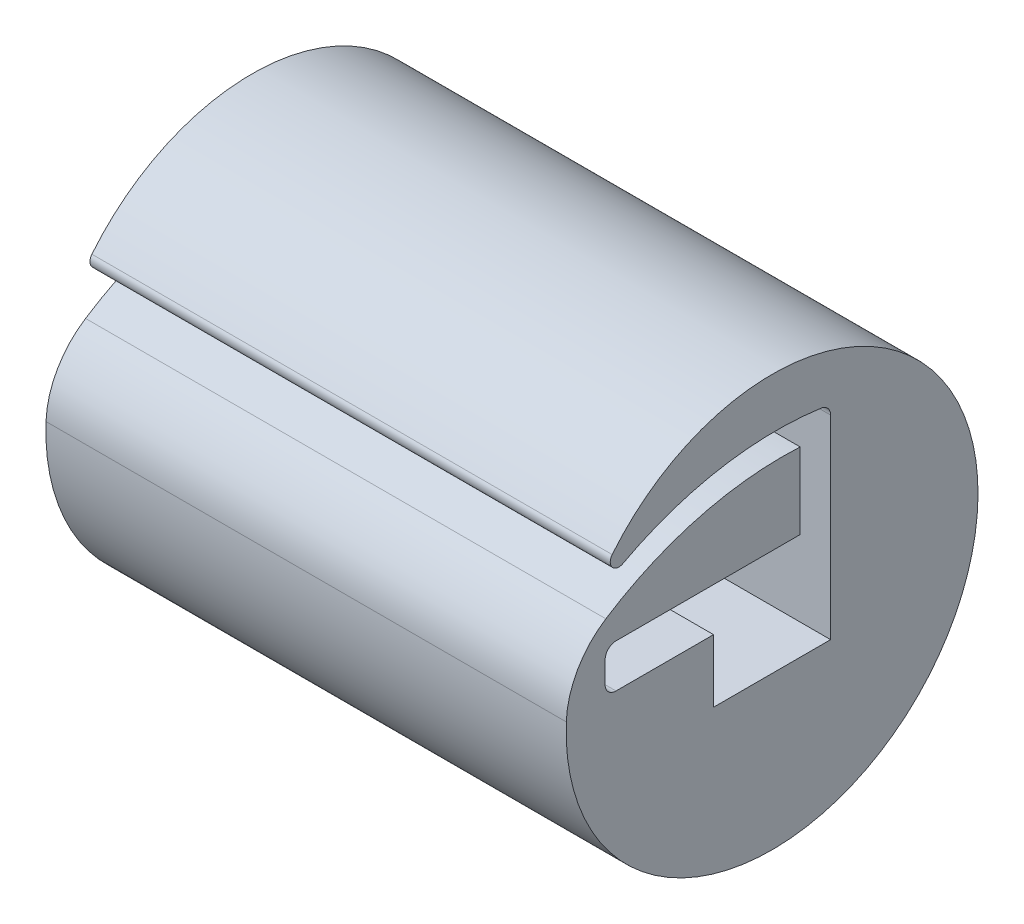
ISO-10303-21;
HEADER;
FILE_DESCRIPTION(('STEP AP214'),'2;1');
FILE_NAME('part.step','',(''),(''),'','','');
FILE_SCHEMA(('AUTOMOTIVE_DESIGN { 1 0 10303 214 1 1 1 1 }'));
ENDSEC;
DATA;
#1=APPLICATION_CONTEXT('core data for automotive mechanical design processes');
#2=APPLICATION_PROTOCOL_DEFINITION('international standard','automotive_design',2000,#1);
#3=PRODUCT_CONTEXT('',#1,'mechanical');
#4=PRODUCT('Part','Part','',(#3));
#5=PRODUCT_RELATED_PRODUCT_CATEGORY('part','',(#4));
#6=PRODUCT_DEFINITION_FORMATION('','',#4);
#7=PRODUCT_DEFINITION_CONTEXT('part definition',#1,'design');
#8=PRODUCT_DEFINITION('design','',#6,#7);
#9=PRODUCT_DEFINITION_SHAPE('','',#8);
#10=(LENGTH_UNIT() NAMED_UNIT(*) SI_UNIT(.MILLI.,.METRE.));
#11=(NAMED_UNIT(*) PLANE_ANGLE_UNIT() SI_UNIT($,.RADIAN.));
#12=(NAMED_UNIT(*) SI_UNIT($,.STERADIAN.) SOLID_ANGLE_UNIT());
#13=UNCERTAINTY_MEASURE_WITH_UNIT(LENGTH_MEASURE(1.E-05),#10,'distance_accuracy_value','');
#14=(GEOMETRIC_REPRESENTATION_CONTEXT(3) GLOBAL_UNCERTAINTY_ASSIGNED_CONTEXT((#13)) GLOBAL_UNIT_ASSIGNED_CONTEXT((#10,
#11,#12)) REPRESENTATION_CONTEXT('',''));
#15=CARTESIAN_POINT('',(0.,0.,0.));
#16=DIRECTION('',(0.,0.,1.));
#17=DIRECTION('',(1.,0.,0.));
#18=AXIS2_PLACEMENT_3D('',#15,#16,#17);
#19=CARTESIAN_POINT('',(6.,-4.51382798752527,-0.239327378792723));
#20=DIRECTION('',(-1.,0.,0.));
#21=DIRECTION('',(0.,0.,1.));
#22=AXIS2_PLACEMENT_3D('',#19,#20,#21);
#23=CYLINDRICAL_SURFACE('',#22,7.5);
#24=CARTESIAN_POINT('',(-6.,-4.51382798752527,-0.239327378792723));
#25=DIRECTION('',(1.,0.,0.));
#26=DIRECTION('',(0.,0.,-1.));
#27=AXIS2_PLACEMENT_3D('',#24,#25,#26);
#28=CIRCLE('',#27,7.5);
#29=CARTESIAN_POINT('',(-6.,1.7834136184432,3.83433782051607));
#30=VERTEX_POINT('',#29);
#31=CARTESIAN_POINT('',(-6.,2.975,-0.648540493511857));
#32=VERTEX_POINT('',#31);
#33=EDGE_CURVE('E188',#30,#32,#28,.F.);
#34=ORIENTED_EDGE('',*,*,#33,.F.);
#35=DIRECTION('',(-1.,0.,0.));
#36=VECTOR('',#35,1.);
#37=CARTESIAN_POINT('',(6.,1.7834136184432,3.83433782051608));
#38=LINE('',#37,#36);
#39=CARTESIAN_POINT('',(6.,1.7834136184432,3.83433782051607));
#40=VERTEX_POINT('',#39);
#41=EDGE_CURVE('E251',#30,#40,#38,.F.);
#42=ORIENTED_EDGE('',*,*,#41,.T.);
#43=CARTESIAN_POINT('',(6.,-4.51382798752527,-0.239327378792723));
#44=DIRECTION('',(1.,0.,0.));
#45=DIRECTION('',(0.,0.,-1.));
#46=AXIS2_PLACEMENT_3D('',#43,#44,#45);
#47=CIRCLE('',#46,7.5);
#48=CARTESIAN_POINT('',(6.,2.975,-0.648540493511857));
#49=VERTEX_POINT('',#48);
#50=EDGE_CURVE('E212',#40,#49,#47,.F.);
#51=ORIENTED_EDGE('',*,*,#50,.T.);
#52=DIRECTION('',(-1.,0.,0.));
#53=VECTOR('',#52,1.);
#54=CARTESIAN_POINT('',(6.,2.975,-0.648540493511857));
#55=LINE('',#54,#53);
#56=EDGE_CURVE('E187',#49,#32,#55,.T.);
#57=ORIENTED_EDGE('',*,*,#56,.T.);
#58=EDGE_LOOP('',(#34,#42,#51,#57));
#59=FACE_BOUND('',#58,.T.);
#60=ADVANCED_FACE('F37',(#59),#23,.T.);
#61=CARTESIAN_POINT('',(6.,0.,0.));
#62=DIRECTION('',(-1.,0.,0.));
#63=DIRECTION('',(0.,0.,1.));
#64=AXIS2_PLACEMENT_3D('',#61,#62,#63);
#65=CYLINDRICAL_SURFACE('',#64,4.75);
#66=CARTESIAN_POINT('',(-6.,0.,0.));
#67=DIRECTION('',(1.,0.,0.));
#68=DIRECTION('',(0.,0.,-1.));
#69=AXIS2_PLACEMENT_3D('',#66,#67,#68);
#70=CIRCLE('',#69,4.75);
#71=CARTESIAN_POINT('',(-6.,0.179894055773986,4.74659226484614));
#72=VERTEX_POINT('',#71);
#73=CARTESIAN_POINT('',(-6.,2.99330265398571,3.68817559528313));
#74=VERTEX_POINT('',#73);
#75=EDGE_CURVE('E190',#72,#74,#70,.T.);
#76=ORIENTED_EDGE('',*,*,#75,.T.);
#77=DIRECTION('',(-1.,0.,0.));
#78=VECTOR('',#77,1.);
#79=CARTESIAN_POINT('',(6.,2.99330265398571,3.68817559528313));
#80=LINE('',#79,#78);
#81=CARTESIAN_POINT('',(6.,2.99330265398571,3.68817559528313));
#82=VERTEX_POINT('',#81);
#83=EDGE_CURVE('E45',#74,#82,#80,.F.);
#84=ORIENTED_EDGE('',*,*,#83,.T.);
#85=CARTESIAN_POINT('',(6.,0.,0.));
#86=DIRECTION('',(1.,0.,0.));
#87=DIRECTION('',(0.,0.,-1.));
#88=AXIS2_PLACEMENT_3D('',#85,#86,#87);
#89=CIRCLE('',#88,4.75);
#90=CARTESIAN_POINT('',(6.,0.179894055773986,4.74659226484614));
#91=VERTEX_POINT('',#90);
#92=EDGE_CURVE('E319',#91,#82,#89,.T.);
#93=ORIENTED_EDGE('',*,*,#92,.F.);
#94=DIRECTION('',(-1.,0.,0.));
#95=VECTOR('',#94,1.);
#96=CARTESIAN_POINT('',(6.,0.179894055773986,4.74659226484614));
#97=LINE('',#96,#95);
#98=EDGE_CURVE('E246',#91,#72,#97,.T.);
#99=ORIENTED_EDGE('',*,*,#98,.T.);
#100=EDGE_LOOP('',(#76,#84,#93,#99));
#101=FACE_BOUND('',#100,.T.);
#102=ADVANCED_FACE('F281',(#101),#65,.T.);
#103=CARTESIAN_POINT('',(6.,-3.92051975857451,-0.102487474798751));
#104=DIRECTION('',(-1.,0.,0.));
#105=DIRECTION('',(0.,0.,1.));
#106=AXIS2_PLACEMENT_3D('',#103,#104,#105);
#107=CYLINDRICAL_SURFACE('',#106,7.5);
#108=CARTESIAN_POINT('',(6.,-3.92051975857451,-0.102487474798751));
#109=DIRECTION('',(1.,0.,0.));
#110=DIRECTION('',(0.,0.,-1.));
#111=AXIS2_PLACEMENT_3D('',#108,#109,#110);
#112=CIRCLE('',#111,7.5);
#113=CARTESIAN_POINT('',(6.,2.69096266019458,3.43845875838628));
#114=VERTEX_POINT('',#113);
#115=CARTESIAN_POINT('',(6.,3.50815191041104,-1.13439698362763));
#116=VERTEX_POINT('',#115);
#117=EDGE_CURVE('E156',#114,#116,#112,.F.);
#118=ORIENTED_EDGE('',*,*,#117,.F.);
#119=DIRECTION('',(-1.,0.,0.));
#120=VECTOR('',#119,1.);
#121=CARTESIAN_POINT('',(6.,2.69096266019458,3.43845875838628));
#122=LINE('',#121,#120);
#123=CARTESIAN_POINT('',(-6.,2.69096266019458,3.43845875838628));
#124=VERTEX_POINT('',#123);
#125=EDGE_CURVE('E255',#114,#124,#122,.T.);
#126=ORIENTED_EDGE('',*,*,#125,.T.);
#127=CARTESIAN_POINT('',(-6.,-3.92051975857451,-0.102487474798751));
#128=DIRECTION('',(1.,0.,0.));
#129=DIRECTION('',(0.,0.,-1.));
#130=AXIS2_PLACEMENT_3D('',#127,#128,#129);
#131=CIRCLE('',#130,7.5);
#132=CARTESIAN_POINT('',(-6.,3.50815191041104,-1.13439698362763));
#133=VERTEX_POINT('',#132);
#134=EDGE_CURVE('E192',#124,#133,#131,.F.);
#135=ORIENTED_EDGE('',*,*,#134,.T.);
#136=DIRECTION('',(-1.,0.,0.));
#137=VECTOR('',#136,1.);
#138=CARTESIAN_POINT('',(6.,3.50815191041104,-1.13439698362763));
#139=LINE('',#138,#137);
#140=EDGE_CURVE('E231',#133,#116,#139,.F.);
#141=ORIENTED_EDGE('',*,*,#140,.T.);
#142=EDGE_LOOP('',(#118,#126,#135,#141));
#143=FACE_BOUND('',#142,.T.);
#144=ADVANCED_FACE('F261',(#143),#107,.F.);
#145=CARTESIAN_POINT('',(6.,0.,-1.35));
#146=DIRECTION('',(0.,0.,-1.));
#147=DIRECTION('',(0.,1.,0.));
#148=AXIS2_PLACEMENT_3D('',#145,#146,#147);
#149=PLANE('',#148);
#150=DIRECTION('',(0.,-1.,0.));
#151=VECTOR('',#150,1.);
#152=CARTESIAN_POINT('',(6.,0.,-1.35));
#153=LINE('',#152,#151);
#154=CARTESIAN_POINT('',(6.,3.26052952144485,-1.35));
#155=VERTEX_POINT('',#154);
#156=CARTESIAN_POINT('',(6.,-1.225,-1.35));
#157=VERTEX_POINT('',#156);
#158=EDGE_CURVE('E144',#155,#157,#153,.T.);
#159=ORIENTED_EDGE('',*,*,#158,.F.);
#160=DIRECTION('',(1.,0.,0.));
#161=VECTOR('',#160,1.);
#162=CARTESIAN_POINT('',(-6.,3.26052952144485,-1.35));
#163=LINE('',#162,#161);
#164=CARTESIAN_POINT('',(-6.,3.26052952144485,-1.35));
#165=VERTEX_POINT('',#164);
#166=EDGE_CURVE('E229',#155,#165,#163,.F.);
#167=ORIENTED_EDGE('',*,*,#166,.T.);
#168=DIRECTION('',(0.,-1.,0.));
#169=VECTOR('',#168,1.);
#170=CARTESIAN_POINT('',(-6.,0.,-1.35));
#171=LINE('',#170,#169);
#172=CARTESIAN_POINT('',(-6.,-1.225,-1.35));
#173=VERTEX_POINT('',#172);
#174=EDGE_CURVE('E162',#165,#173,#171,.T.);
#175=ORIENTED_EDGE('',*,*,#174,.T.);
#176=DIRECTION('',(-1.,0.,0.));
#177=VECTOR('',#176,1.);
#178=CARTESIAN_POINT('',(6.,-1.225,-1.35));
#179=LINE('',#178,#177);
#180=EDGE_CURVE('E159',#157,#173,#179,.T.);
#181=ORIENTED_EDGE('',*,*,#180,.F.);
#182=EDGE_LOOP('',(#159,#167,#175,#181));
#183=FACE_BOUND('',#182,.T.);
#184=ADVANCED_FACE('F160',(#183),#149,.F.);
#185=CARTESIAN_POINT('',(6.,-1.225,0.));
#186=DIRECTION('',(0.,1.,0.));
#187=DIRECTION('',(0.,0.,1.));
#188=AXIS2_PLACEMENT_3D('',#185,#186,#187);
#189=PLANE('',#188);
#190=DIRECTION('',(0.,0.,-1.));
#191=VECTOR('',#190,1.);
#192=CARTESIAN_POINT('',(-6.,-1.225,0.));
#193=LINE('',#192,#191);
#194=CARTESIAN_POINT('',(-6.,-1.225,1.35));
#195=VERTEX_POINT('',#194);
#196=EDGE_CURVE('E195',#195,#173,#193,.T.);
#197=ORIENTED_EDGE('',*,*,#196,.F.);
#198=DIRECTION('',(-1.,0.,0.));
#199=VECTOR('',#198,1.);
#200=CARTESIAN_POINT('',(6.,-1.225,1.35));
#201=LINE('',#200,#199);
#202=CARTESIAN_POINT('',(6.,-1.225,1.35));
#203=VERTEX_POINT('',#202);
#204=EDGE_CURVE('E167',#203,#195,#201,.T.);
#205=ORIENTED_EDGE('',*,*,#204,.F.);
#206=DIRECTION('',(0.,0.,-1.));
#207=VECTOR('',#206,1.);
#208=CARTESIAN_POINT('',(6.,-1.225,0.));
#209=LINE('',#208,#207);
#210=EDGE_CURVE('E149',#203,#157,#209,.T.);
#211=ORIENTED_EDGE('',*,*,#210,.T.);
#212=ORIENTED_EDGE('',*,*,#180,.T.);
#213=EDGE_LOOP('',(#197,#205,#211,#212));
#214=FACE_BOUND('',#213,.T.);
#215=ADVANCED_FACE('F169',(#214),#189,.T.);
#216=CARTESIAN_POINT('',(6.,0.,1.35));
#217=DIRECTION('',(0.,0.,-1.));
#218=DIRECTION('',(0.,1.,0.));
#219=AXIS2_PLACEMENT_3D('',#216,#217,#218);
#220=PLANE('',#219);
#221=DIRECTION('',(0.,-1.,0.));
#222=VECTOR('',#221,1.);
#223=CARTESIAN_POINT('',(-6.,0.,1.35));
#224=LINE('',#223,#222);
#225=CARTESIAN_POINT('',(-6.,0.225,1.35));
#226=VERTEX_POINT('',#225);
#227=EDGE_CURVE('E197',#226,#195,#224,.T.);
#228=ORIENTED_EDGE('',*,*,#227,.F.);
#229=DIRECTION('',(-1.,0.,0.));
#230=VECTOR('',#229,1.);
#231=CARTESIAN_POINT('',(6.,0.225,1.35));
#232=LINE('',#231,#230);
#233=CARTESIAN_POINT('',(6.,0.225,1.35));
#234=VERTEX_POINT('',#233);
#235=EDGE_CURVE('E217',#234,#226,#232,.T.);
#236=ORIENTED_EDGE('',*,*,#235,.F.);
#237=DIRECTION('',(0.,-1.,0.));
#238=VECTOR('',#237,1.);
#239=CARTESIAN_POINT('',(6.,0.,1.35));
#240=LINE('',#239,#238);
#241=EDGE_CURVE('E170',#234,#203,#240,.T.);
#242=ORIENTED_EDGE('',*,*,#241,.T.);
#243=ORIENTED_EDGE('',*,*,#204,.T.);
#244=EDGE_LOOP('',(#228,#236,#242,#243));
#245=FACE_BOUND('',#244,.T.);
#246=ADVANCED_FACE('F328',(#245),#220,.T.);
#247=CARTESIAN_POINT('',(6.,0.225,0.));
#248=DIRECTION('',(0.,-1.,0.));
#249=DIRECTION('',(0.,0.,-1.));
#250=AXIS2_PLACEMENT_3D('',#247,#248,#249);
#251=PLANE('',#250);
#252=DIRECTION('',(0.,0.,1.));
#253=VECTOR('',#252,1.);
#254=CARTESIAN_POINT('',(-6.,0.225,0.));
#255=LINE('',#254,#253);
#256=CARTESIAN_POINT('',(-6.,0.225,3.6));
#257=VERTEX_POINT('',#256);
#258=EDGE_CURVE('E200',#226,#257,#255,.T.);
#259=ORIENTED_EDGE('',*,*,#258,.T.);
#260=DIRECTION('',(-1.,0.,0.));
#261=VECTOR('',#260,1.);
#262=CARTESIAN_POINT('',(6.,0.225,3.6));
#263=LINE('',#262,#261);
#264=CARTESIAN_POINT('',(6.,0.225,3.6));
#265=VERTEX_POINT('',#264);
#266=EDGE_CURVE('E224',#257,#265,#263,.F.);
#267=ORIENTED_EDGE('',*,*,#266,.T.);
#268=DIRECTION('',(0.,0.,1.));
#269=VECTOR('',#268,1.);
#270=CARTESIAN_POINT('',(6.,0.225,0.));
#271=LINE('',#270,#269);
#272=EDGE_CURVE('E172',#234,#265,#271,.T.);
#273=ORIENTED_EDGE('',*,*,#272,.F.);
#274=ORIENTED_EDGE('',*,*,#235,.T.);
#275=EDGE_LOOP('',(#259,#267,#273,#274));
#276=FACE_BOUND('',#275,.T.);
#277=ADVANCED_FACE('F326',(#276),#251,.F.);
#278=CARTESIAN_POINT('',(6.,0.,3.85));
#279=DIRECTION('',(0.,0.,-1.));
#280=DIRECTION('',(-1.,0.,0.));
#281=AXIS2_PLACEMENT_3D('',#278,#279,#280);
#282=PLANE('',#281);
#283=DIRECTION('',(0.,-1.,0.));
#284=VECTOR('',#283,1.);
#285=CARTESIAN_POINT('',(6.,0.,3.85));
#286=LINE('',#285,#284);
#287=CARTESIAN_POINT('',(6.,0.975,3.85));
#288=VERTEX_POINT('',#287);
#289=CARTESIAN_POINT('',(6.,0.475,3.85));
#290=VERTEX_POINT('',#289);
#291=EDGE_CURVE('E178',#288,#290,#286,.T.);
#292=ORIENTED_EDGE('',*,*,#291,.T.);
#293=DIRECTION('',(-1.,0.,0.));
#294=VECTOR('',#293,1.);
#295=CARTESIAN_POINT('',(6.,0.475,3.85));
#296=LINE('',#295,#294);
#297=CARTESIAN_POINT('',(-6.,0.475,3.85));
#298=VERTEX_POINT('',#297);
#299=EDGE_CURVE('E221',#290,#298,#296,.T.);
#300=ORIENTED_EDGE('',*,*,#299,.T.);
#301=DIRECTION('',(0.,-1.,0.));
#302=VECTOR('',#301,1.);
#303=CARTESIAN_POINT('',(-6.,0.,3.85));
#304=LINE('',#303,#302);
#305=CARTESIAN_POINT('',(-6.,0.975,3.85));
#306=VERTEX_POINT('',#305);
#307=EDGE_CURVE('E203',#306,#298,#304,.T.);
#308=ORIENTED_EDGE('',*,*,#307,.F.);
#309=DIRECTION('',(-1.,0.,0.));
#310=VECTOR('',#309,1.);
#311=CARTESIAN_POINT('',(6.,0.975,3.85));
#312=LINE('',#311,#310);
#313=EDGE_CURVE('E166',#306,#288,#312,.F.);
#314=ORIENTED_EDGE('',*,*,#313,.T.);
#315=EDGE_LOOP('',(#292,#300,#308,#314));
#316=FACE_BOUND('',#315,.T.);
#317=ADVANCED_FACE('F304',(#316),#282,.T.);
#318=CARTESIAN_POINT('',(6.,1.225,0.));
#319=DIRECTION('',(0.,-1.,0.));
#320=DIRECTION('',(0.,0.,-1.));
#321=AXIS2_PLACEMENT_3D('',#318,#319,#320);
#322=PLANE('',#321);
#323=DIRECTION('',(0.,0.,1.));
#324=VECTOR('',#323,1.);
#325=CARTESIAN_POINT('',(6.,1.225,0.));
#326=LINE('',#325,#324);
#327=CARTESIAN_POINT('',(6.,1.225,-0.648540493511857));
#328=VERTEX_POINT('',#327);
#329=CARTESIAN_POINT('',(6.,1.225,3.6));
#330=VERTEX_POINT('',#329);
#331=EDGE_CURVE('E181',#328,#330,#326,.T.);
#332=ORIENTED_EDGE('',*,*,#331,.T.);
#333=DIRECTION('',(-1.,0.,0.));
#334=VECTOR('',#333,1.);
#335=CARTESIAN_POINT('',(-6.,1.225,3.6));
#336=LINE('',#335,#334);
#337=CARTESIAN_POINT('',(-6.,1.225,3.6));
#338=VERTEX_POINT('',#337);
#339=EDGE_CURVE('E226',#330,#338,#336,.T.);
#340=ORIENTED_EDGE('',*,*,#339,.T.);
#341=DIRECTION('',(0.,0.,1.));
#342=VECTOR('',#341,1.);
#343=CARTESIAN_POINT('',(-6.,1.225,0.));
#344=LINE('',#343,#342);
#345=CARTESIAN_POINT('',(-6.,1.225,-0.648540493511857));
#346=VERTEX_POINT('',#345);
#347=EDGE_CURVE('E206',#346,#338,#344,.T.);
#348=ORIENTED_EDGE('',*,*,#347,.F.);
#349=DIRECTION('',(-1.,0.,0.));
#350=VECTOR('',#349,1.);
#351=CARTESIAN_POINT('',(6.,1.225,-0.648540493511857));
#352=LINE('',#351,#350);
#353=EDGE_CURVE('E215',#328,#346,#352,.T.);
#354=ORIENTED_EDGE('',*,*,#353,.F.);
#355=EDGE_LOOP('',(#332,#340,#348,#354));
#356=FACE_BOUND('',#355,.T.);
#357=ADVANCED_FACE('F310',(#356),#322,.T.);
#358=CARTESIAN_POINT('',(6.,0.,-0.648540493511857));
#359=DIRECTION('',(0.,0.,1.));
#360=DIRECTION('',(0.,-1.,0.));
#361=AXIS2_PLACEMENT_3D('',#358,#359,#360);
#362=PLANE('',#361);
#363=DIRECTION('',(0.,1.,0.));
#364=VECTOR('',#363,1.);
#365=CARTESIAN_POINT('',(-6.,0.,-0.648540493511857));
#366=LINE('',#365,#364);
#367=EDGE_CURVE('E209',#346,#32,#366,.T.);
#368=ORIENTED_EDGE('',*,*,#367,.T.);
#369=ORIENTED_EDGE('',*,*,#56,.F.);
#370=DIRECTION('',(0.,1.,0.));
#371=VECTOR('',#370,1.);
#372=CARTESIAN_POINT('',(6.,0.,-0.648540493511857));
#373=LINE('',#372,#371);
#374=EDGE_CURVE('E184',#328,#49,#373,.T.);
#375=ORIENTED_EDGE('',*,*,#374,.F.);
#376=ORIENTED_EDGE('',*,*,#353,.T.);
#377=EDGE_LOOP('',(#368,#369,#375,#376));
#378=FACE_BOUND('',#377,.T.);
#379=ADVANCED_FACE('F316',(#378),#362,.F.);
#380=CARTESIAN_POINT('',(6.,0.,0.));
#381=DIRECTION('',(1.,0.,0.));
#382=DIRECTION('',(0.,0.,-1.));
#383=AXIS2_PLACEMENT_3D('',#380,#381,#382);
#384=PLANE('',#383);
#385=ORIENTED_EDGE('',*,*,#92,.T.);
#386=CARTESIAN_POINT('',(6.,2.86726885802842,3.53288399127121));
#387=DIRECTION('',(1.,0.,0.));
#388=DIRECTION('',(0.,0.,-1.));
#389=AXIS2_PLACEMENT_3D('',#386,#387,#388);
#390=CIRCLE('',#389,0.2);
#391=EDGE_CURVE('E11',#82,#114,#390,.T.);
#392=ORIENTED_EDGE('',*,*,#391,.T.);
#393=ORIENTED_EDGE('',*,*,#117,.T.);
#394=CARTESIAN_POINT('',(6.,3.26052952144485,-1.1));
#395=DIRECTION('',(1.,0.,0.));
#396=DIRECTION('',(0.,0.,-1.));
#397=AXIS2_PLACEMENT_3D('',#394,#395,#396);
#398=CIRCLE('',#397,0.25);
#399=EDGE_CURVE('E152',#116,#155,#398,.F.);
#400=ORIENTED_EDGE('',*,*,#399,.T.);
#401=ORIENTED_EDGE('',*,*,#158,.T.);
#402=ORIENTED_EDGE('',*,*,#210,.F.);
#403=ORIENTED_EDGE('',*,*,#241,.F.);
#404=ORIENTED_EDGE('',*,*,#272,.T.);
#405=CARTESIAN_POINT('',(6.,0.475,3.6));
#406=DIRECTION('',(1.,0.,0.));
#407=DIRECTION('',(0.,0.,-1.));
#408=AXIS2_PLACEMENT_3D('',#405,#406,#407);
#409=CIRCLE('',#408,0.25);
#410=EDGE_CURVE('E236',#265,#290,#409,.F.);
#411=ORIENTED_EDGE('',*,*,#410,.T.);
#412=ORIENTED_EDGE('',*,*,#291,.F.);
#413=CARTESIAN_POINT('',(6.,0.975,3.6));
#414=DIRECTION('',(1.,0.,0.));
#415=DIRECTION('',(0.,0.,-1.));
#416=AXIS2_PLACEMENT_3D('',#413,#414,#415);
#417=CIRCLE('',#416,0.25);
#418=EDGE_CURVE('E240',#288,#330,#417,.F.);
#419=ORIENTED_EDGE('',*,*,#418,.T.);
#420=ORIENTED_EDGE('',*,*,#331,.F.);
#421=ORIENTED_EDGE('',*,*,#374,.T.);
#422=ORIENTED_EDGE('',*,*,#50,.F.);
#423=CARTESIAN_POINT('',(6.,0.10414919018494,2.7480271007004));
#424=DIRECTION('',(1.,0.,0.));
#425=DIRECTION('',(0.,0.,-1.));
#426=AXIS2_PLACEMENT_3D('',#423,#424,#425);
#427=CIRCLE('',#426,2.);
#428=EDGE_CURVE('E253',#40,#91,#427,.T.);
#429=ORIENTED_EDGE('',*,*,#428,.T.);
#430=EDGE_LOOP('',(#385,#392,#393,#400,#401,#402,#403,#404,#411,#412,#419,#420,#421,#422,#429));
#431=FACE_BOUND('',#430,.T.);
#432=ADVANCED_FACE('F146',(#431),#384,.T.);
#433=CARTESIAN_POINT('',(-6.,0.,0.));
#434=DIRECTION('',(1.,0.,0.));
#435=DIRECTION('',(0.,0.,-1.));
#436=AXIS2_PLACEMENT_3D('',#433,#434,#435);
#437=PLANE('',#436);
#438=ORIENTED_EDGE('',*,*,#134,.F.);
#439=CARTESIAN_POINT('',(-6.,2.86726885802842,3.53288399127121));
#440=DIRECTION('',(1.,0.,0.));
#441=DIRECTION('',(0.,0.,-1.));
#442=AXIS2_PLACEMENT_3D('',#439,#440,#441);
#443=CIRCLE('',#442,0.2);
#444=EDGE_CURVE('E59',#124,#74,#443,.F.);
#445=ORIENTED_EDGE('',*,*,#444,.T.);
#446=ORIENTED_EDGE('',*,*,#75,.F.);
#447=CARTESIAN_POINT('',(-6.,0.10414919018494,2.7480271007004));
#448=DIRECTION('',(1.,0.,0.));
#449=DIRECTION('',(0.,0.,-1.));
#450=AXIS2_PLACEMENT_3D('',#447,#448,#449);
#451=CIRCLE('',#450,2.);
#452=EDGE_CURVE('E249',#72,#30,#451,.F.);
#453=ORIENTED_EDGE('',*,*,#452,.T.);
#454=ORIENTED_EDGE('',*,*,#33,.T.);
#455=ORIENTED_EDGE('',*,*,#367,.F.);
#456=ORIENTED_EDGE('',*,*,#347,.T.);
#457=CARTESIAN_POINT('',(-6.,0.975,3.6));
#458=DIRECTION('',(1.,0.,0.));
#459=DIRECTION('',(0.,0.,-1.));
#460=AXIS2_PLACEMENT_3D('',#457,#458,#459);
#461=CIRCLE('',#460,0.25);
#462=EDGE_CURVE('E238',#338,#306,#461,.T.);
#463=ORIENTED_EDGE('',*,*,#462,.T.);
#464=ORIENTED_EDGE('',*,*,#307,.T.);
#465=CARTESIAN_POINT('',(-6.,0.475,3.6));
#466=DIRECTION('',(1.,0.,0.));
#467=DIRECTION('',(0.,0.,-1.));
#468=AXIS2_PLACEMENT_3D('',#465,#466,#467);
#469=CIRCLE('',#468,0.25);
#470=EDGE_CURVE('E234',#298,#257,#469,.T.);
#471=ORIENTED_EDGE('',*,*,#470,.T.);
#472=ORIENTED_EDGE('',*,*,#258,.F.);
#473=ORIENTED_EDGE('',*,*,#227,.T.);
#474=ORIENTED_EDGE('',*,*,#196,.T.);
#475=ORIENTED_EDGE('',*,*,#174,.F.);
#476=CARTESIAN_POINT('',(-6.,3.26052952144485,-1.1));
#477=DIRECTION('',(1.,0.,0.));
#478=DIRECTION('',(0.,0.,-1.));
#479=AXIS2_PLACEMENT_3D('',#476,#477,#478);
#480=CIRCLE('',#479,0.25);
#481=EDGE_CURVE('E242',#165,#133,#480,.T.);
#482=ORIENTED_EDGE('',*,*,#481,.T.);
#483=EDGE_LOOP('',(#438,#445,#446,#453,#454,#455,#456,#463,#464,#471,#472,#473,#474,#475,#482));
#484=FACE_BOUND('',#483,.T.);
#485=ADVANCED_FACE('F264',(#484),#437,.F.);
#486=CARTESIAN_POINT('',(6.,0.475,3.6));
#487=DIRECTION('',(-1.,0.,0.));
#488=DIRECTION('',(0.,0.,1.));
#489=AXIS2_PLACEMENT_3D('',#486,#487,#488);
#490=CYLINDRICAL_SURFACE('',#489,0.25);
#491=ORIENTED_EDGE('',*,*,#410,.F.);
#492=ORIENTED_EDGE('',*,*,#266,.F.);
#493=ORIENTED_EDGE('',*,*,#470,.F.);
#494=ORIENTED_EDGE('',*,*,#299,.F.);
#495=EDGE_LOOP('',(#491,#492,#493,#494));
#496=FACE_BOUND('',#495,.T.);
#497=ADVANCED_FACE('F277',(#496),#490,.F.);
#498=CARTESIAN_POINT('',(6.,0.975,3.6));
#499=DIRECTION('',(1.,0.,0.));
#500=DIRECTION('',(0.,0.,-1.));
#501=AXIS2_PLACEMENT_3D('',#498,#499,#500);
#502=CYLINDRICAL_SURFACE('',#501,0.25);
#503=ORIENTED_EDGE('',*,*,#418,.F.);
#504=ORIENTED_EDGE('',*,*,#313,.F.);
#505=ORIENTED_EDGE('',*,*,#462,.F.);
#506=ORIENTED_EDGE('',*,*,#339,.F.);
#507=EDGE_LOOP('',(#503,#504,#505,#506));
#508=FACE_BOUND('',#507,.T.);
#509=ADVANCED_FACE('F270',(#508),#502,.F.);
#510=CARTESIAN_POINT('',(6.,3.26052952144485,-1.1));
#511=DIRECTION('',(-1.,0.,0.));
#512=DIRECTION('',(0.,0.,1.));
#513=AXIS2_PLACEMENT_3D('',#510,#511,#512);
#514=CYLINDRICAL_SURFACE('',#513,0.25);
#515=ORIENTED_EDGE('',*,*,#399,.F.);
#516=ORIENTED_EDGE('',*,*,#140,.F.);
#517=ORIENTED_EDGE('',*,*,#481,.F.);
#518=ORIENTED_EDGE('',*,*,#166,.F.);
#519=EDGE_LOOP('',(#515,#516,#517,#518));
#520=FACE_BOUND('',#519,.T.);
#521=ADVANCED_FACE('F267',(#520),#514,.F.);
#522=CARTESIAN_POINT('',(6.,0.10414919018494,2.7480271007004));
#523=DIRECTION('',(-1.,0.,0.));
#524=DIRECTION('',(0.,0.,1.));
#525=AXIS2_PLACEMENT_3D('',#522,#523,#524);
#526=CYLINDRICAL_SURFACE('',#525,2.);
#527=ORIENTED_EDGE('',*,*,#428,.F.);
#528=ORIENTED_EDGE('',*,*,#41,.F.);
#529=ORIENTED_EDGE('',*,*,#452,.F.);
#530=ORIENTED_EDGE('',*,*,#98,.F.);
#531=EDGE_LOOP('',(#527,#528,#529,#530));
#532=FACE_BOUND('',#531,.T.);
#533=ADVANCED_FACE('F269',(#532),#526,.T.);
#534=CARTESIAN_POINT('',(6.,2.86726885802842,3.53288399127121));
#535=DIRECTION('',(1.,0.,0.));
#536=DIRECTION('',(0.,0.,-1.));
#537=AXIS2_PLACEMENT_3D('',#534,#535,#536);
#538=CYLINDRICAL_SURFACE('',#537,0.2);
#539=ORIENTED_EDGE('',*,*,#391,.F.);
#540=ORIENTED_EDGE('',*,*,#83,.F.);
#541=ORIENTED_EDGE('',*,*,#444,.F.);
#542=ORIENTED_EDGE('',*,*,#125,.F.);
#543=EDGE_LOOP('',(#539,#540,#541,#542));
#544=FACE_BOUND('',#543,.T.);
#545=ADVANCED_FACE('F39',(#544),#538,.T.);
#546=CLOSED_SHELL('',(#60,#102,#144,#184,#215,#246,#277,#317,#357,#379,#432,#485,#497,#509,#521,
#533,#545));
#547=MANIFOLD_SOLID_BREP('B2',#546);
#548=ADVANCED_BREP_SHAPE_REPRESENTATION('',(#18,#547),#14);
#549=SHAPE_DEFINITION_REPRESENTATION(#9,#548);
ENDSEC;
END-ISO-10303-21;
